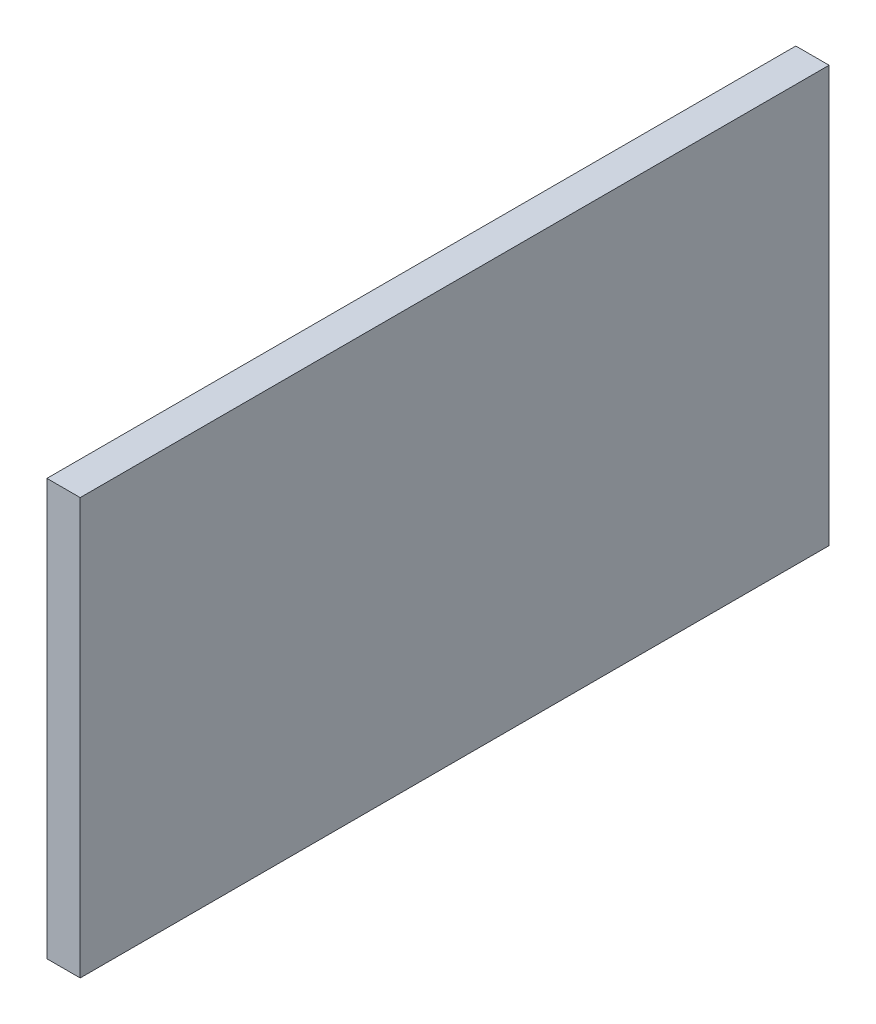
ISO-10303-21;
HEADER;
FILE_DESCRIPTION(('STEP AP214'),'2;1');
FILE_NAME('part.step','',(''),(''),'','','');
FILE_SCHEMA(('AUTOMOTIVE_DESIGN { 1 0 10303 214 1 1 1 1 }'));
ENDSEC;
DATA;
#1=APPLICATION_CONTEXT('core data for automotive mechanical design processes');
#2=APPLICATION_PROTOCOL_DEFINITION('international standard','automotive_design',2000,#1);
#3=PRODUCT_CONTEXT('',#1,'mechanical');
#4=PRODUCT('Part','Part','',(#3));
#5=PRODUCT_RELATED_PRODUCT_CATEGORY('part','',(#4));
#6=PRODUCT_DEFINITION_FORMATION('','',#4);
#7=PRODUCT_DEFINITION_CONTEXT('part definition',#1,'design');
#8=PRODUCT_DEFINITION('design','',#6,#7);
#9=PRODUCT_DEFINITION_SHAPE('','',#8);
#10=(LENGTH_UNIT() NAMED_UNIT(*) SI_UNIT(.MILLI.,.METRE.));
#11=(NAMED_UNIT(*) PLANE_ANGLE_UNIT() SI_UNIT($,.RADIAN.));
#12=(NAMED_UNIT(*) SI_UNIT($,.STERADIAN.) SOLID_ANGLE_UNIT());
#13=UNCERTAINTY_MEASURE_WITH_UNIT(LENGTH_MEASURE(1.E-05),#10,'distance_accuracy_value','');
#14=(GEOMETRIC_REPRESENTATION_CONTEXT(3) GLOBAL_UNCERTAINTY_ASSIGNED_CONTEXT((#13)) GLOBAL_UNIT_ASSIGNED_CONTEXT((#10,
#11,#12)) REPRESENTATION_CONTEXT('',''));
#15=CARTESIAN_POINT('',(0.,0.,0.));
#16=DIRECTION('',(0.,0.,1.));
#17=DIRECTION('',(1.,0.,0.));
#18=AXIS2_PLACEMENT_3D('',#15,#16,#17);
#19=CARTESIAN_POINT('',(4.,0.,0.));
#20=DIRECTION('',(0.,0.,-1.));
#21=DIRECTION('',(0.,1.,0.));
#22=AXIS2_PLACEMENT_3D('',#19,#20,#21);
#23=PLANE('',#22);
#24=DIRECTION('',(0.,-1.,0.));
#25=VECTOR('',#24,1.);
#26=CARTESIAN_POINT('',(0.,0.,0.));
#27=LINE('',#26,#25);
#28=CARTESIAN_POINT('',(0.,0.,0.));
#29=VERTEX_POINT('',#28);
#30=CARTESIAN_POINT('',(0.,-50.,0.));
#31=VERTEX_POINT('',#30);
#32=EDGE_CURVE('E109',#29,#31,#27,.T.);
#33=ORIENTED_EDGE('',*,*,#32,.T.);
#34=DIRECTION('',(-1.,0.,0.));
#35=VECTOR('',#34,1.);
#36=CARTESIAN_POINT('',(4.,-50.,0.));
#37=LINE('',#36,#35);
#38=CARTESIAN_POINT('',(4.,-50.,0.));
#39=VERTEX_POINT('',#38);
#40=EDGE_CURVE('E11',#39,#31,#37,.T.);
#41=ORIENTED_EDGE('',*,*,#40,.F.);
#42=DIRECTION('',(0.,-1.,0.));
#43=VECTOR('',#42,1.);
#44=CARTESIAN_POINT('',(4.,0.,0.));
#45=LINE('',#44,#43);
#46=CARTESIAN_POINT('',(4.,0.,0.));
#47=VERTEX_POINT('',#46);
#48=EDGE_CURVE('E93',#47,#39,#45,.T.);
#49=ORIENTED_EDGE('',*,*,#48,.F.);
#50=DIRECTION('',(-1.,0.,0.));
#51=VECTOR('',#50,1.);
#52=CARTESIAN_POINT('',(4.,0.,0.));
#53=LINE('',#52,#51);
#54=EDGE_CURVE('E105',#47,#29,#53,.T.);
#55=ORIENTED_EDGE('',*,*,#54,.T.);
#56=EDGE_LOOP('',(#33,#41,#49,#55));
#57=FACE_BOUND('',#56,.T.);
#58=ADVANCED_FACE('F41',(#57),#23,.F.);
#59=CARTESIAN_POINT('',(4.,-50.,0.));
#60=DIRECTION('',(0.,1.,0.));
#61=DIRECTION('',(0.,0.,1.));
#62=AXIS2_PLACEMENT_3D('',#59,#60,#61);
#63=PLANE('',#62);
#64=DIRECTION('',(0.,0.,-1.));
#65=VECTOR('',#64,1.);
#66=CARTESIAN_POINT('',(0.,-50.,0.));
#67=LINE('',#66,#65);
#68=CARTESIAN_POINT('',(0.,-50.,-90.));
#69=VERTEX_POINT('',#68);
#70=EDGE_CURVE('E98',#31,#69,#67,.T.);
#71=ORIENTED_EDGE('',*,*,#70,.T.);
#72=DIRECTION('',(-1.,0.,0.));
#73=VECTOR('',#72,1.);
#74=CARTESIAN_POINT('',(4.,-50.,-90.));
#75=LINE('',#74,#73);
#76=CARTESIAN_POINT('',(4.,-50.,-90.));
#77=VERTEX_POINT('',#76);
#78=EDGE_CURVE('E50',#77,#69,#75,.T.);
#79=ORIENTED_EDGE('',*,*,#78,.F.);
#80=DIRECTION('',(0.,0.,-1.));
#81=VECTOR('',#80,1.);
#82=CARTESIAN_POINT('',(4.,-50.,0.));
#83=LINE('',#82,#81);
#84=EDGE_CURVE('E88',#39,#77,#83,.T.);
#85=ORIENTED_EDGE('',*,*,#84,.F.);
#86=ORIENTED_EDGE('',*,*,#40,.T.);
#87=EDGE_LOOP('',(#71,#79,#85,#86));
#88=FACE_BOUND('',#87,.T.);
#89=ADVANCED_FACE('F97',(#88),#63,.F.);
#90=CARTESIAN_POINT('',(4.,0.,-90.));
#91=DIRECTION('',(0.,0.,1.));
#92=DIRECTION('',(1.,0.,0.));
#93=AXIS2_PLACEMENT_3D('',#90,#91,#92);
#94=PLANE('',#93);
#95=DIRECTION('',(0.,1.,0.));
#96=VECTOR('',#95,1.);
#97=CARTESIAN_POINT('',(0.,0.,-90.));
#98=LINE('',#97,#96);
#99=CARTESIAN_POINT('',(0.,0.,-90.));
#100=VERTEX_POINT('',#99);
#101=EDGE_CURVE('E75',#69,#100,#98,.T.);
#102=ORIENTED_EDGE('',*,*,#101,.T.);
#103=DIRECTION('',(-1.,0.,0.));
#104=VECTOR('',#103,1.);
#105=CARTESIAN_POINT('',(4.,0.,-90.));
#106=LINE('',#105,#104);
#107=CARTESIAN_POINT('',(4.,0.,-90.));
#108=VERTEX_POINT('',#107);
#109=EDGE_CURVE('E100',#108,#100,#106,.T.);
#110=ORIENTED_EDGE('',*,*,#109,.F.);
#111=DIRECTION('',(0.,1.,0.));
#112=VECTOR('',#111,1.);
#113=CARTESIAN_POINT('',(4.,0.,-90.));
#114=LINE('',#113,#112);
#115=EDGE_CURVE('E91',#77,#108,#114,.T.);
#116=ORIENTED_EDGE('',*,*,#115,.F.);
#117=ORIENTED_EDGE('',*,*,#78,.T.);
#118=EDGE_LOOP('',(#102,#110,#116,#117));
#119=FACE_BOUND('',#118,.T.);
#120=ADVANCED_FACE('F101',(#119),#94,.F.);
#121=CARTESIAN_POINT('',(4.,0.,0.));
#122=DIRECTION('',(0.,-1.,0.));
#123=DIRECTION('',(0.,0.,-1.));
#124=AXIS2_PLACEMENT_3D('',#121,#122,#123);
#125=PLANE('',#124);
#126=DIRECTION('',(0.,0.,1.));
#127=VECTOR('',#126,1.);
#128=CARTESIAN_POINT('',(0.,0.,0.));
#129=LINE('',#128,#127);
#130=EDGE_CURVE('E81',#100,#29,#129,.T.);
#131=ORIENTED_EDGE('',*,*,#130,.T.);
#132=ORIENTED_EDGE('',*,*,#54,.F.);
#133=DIRECTION('',(0.,0.,1.));
#134=VECTOR('',#133,1.);
#135=CARTESIAN_POINT('',(4.,0.,0.));
#136=LINE('',#135,#134);
#137=EDGE_CURVE('E58',#108,#47,#136,.T.);
#138=ORIENTED_EDGE('',*,*,#137,.F.);
#139=ORIENTED_EDGE('',*,*,#109,.T.);
#140=EDGE_LOOP('',(#131,#132,#138,#139));
#141=FACE_BOUND('',#140,.T.);
#142=ADVANCED_FACE('F122',(#141),#125,.F.);
#143=CARTESIAN_POINT('',(4.,0.,0.));
#144=DIRECTION('',(1.,0.,0.));
#145=DIRECTION('',(0.,0.,-1.));
#146=AXIS2_PLACEMENT_3D('',#143,#144,#145);
#147=PLANE('',#146);
#148=ORIENTED_EDGE('',*,*,#48,.T.);
#149=ORIENTED_EDGE('',*,*,#84,.T.);
#150=ORIENTED_EDGE('',*,*,#115,.T.);
#151=ORIENTED_EDGE('',*,*,#137,.T.);
#152=EDGE_LOOP('',(#148,#149,#150,#151));
#153=FACE_BOUND('',#152,.T.);
#154=ADVANCED_FACE('F89',(#153),#147,.T.);
#155=CARTESIAN_POINT('',(0.,0.,0.));
#156=DIRECTION('',(1.,0.,0.));
#157=DIRECTION('',(0.,0.,-1.));
#158=AXIS2_PLACEMENT_3D('',#155,#156,#157);
#159=PLANE('',#158);
#160=ORIENTED_EDGE('',*,*,#32,.F.);
#161=ORIENTED_EDGE('',*,*,#130,.F.);
#162=ORIENTED_EDGE('',*,*,#101,.F.);
#163=ORIENTED_EDGE('',*,*,#70,.F.);
#164=EDGE_LOOP('',(#160,#161,#162,#163));
#165=FACE_BOUND('',#164,.T.);
#166=ADVANCED_FACE('F125',(#165),#159,.F.);
#167=CLOSED_SHELL('',(#58,#89,#120,#142,#154,#166));
#168=MANIFOLD_SOLID_BREP('B2',#167);
#169=ADVANCED_BREP_SHAPE_REPRESENTATION('',(#18,#168),#14);
#170=SHAPE_DEFINITION_REPRESENTATION(#9,#169);
ENDSEC;
END-ISO-10303-21;
